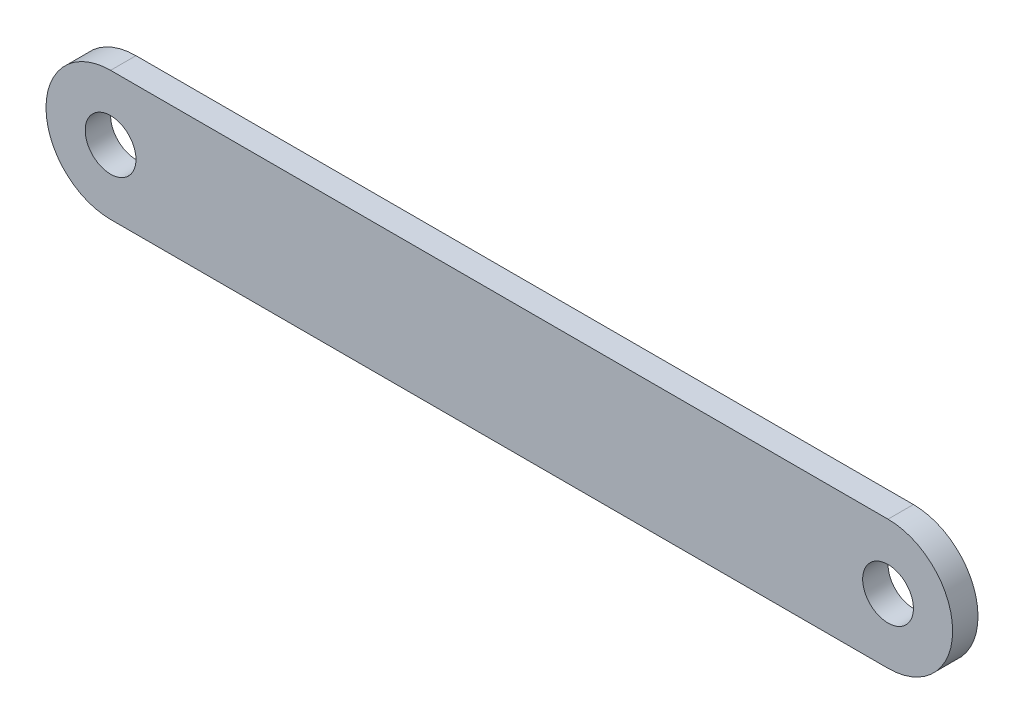
ISO-10303-21;
HEADER;
FILE_DESCRIPTION(('STEP AP214'),'2;1');
FILE_NAME('part.step','',(''),(''),'','','');
FILE_SCHEMA(('AUTOMOTIVE_DESIGN { 1 0 10303 214 1 1 1 1 }'));
ENDSEC;
DATA;
#1=APPLICATION_CONTEXT('core data for automotive mechanical design processes');
#2=APPLICATION_PROTOCOL_DEFINITION('international standard','automotive_design',2000,#1);
#3=PRODUCT_CONTEXT('',#1,'mechanical');
#4=PRODUCT('Part','Part','',(#3));
#5=PRODUCT_RELATED_PRODUCT_CATEGORY('part','',(#4));
#6=PRODUCT_DEFINITION_FORMATION('','',#4);
#7=PRODUCT_DEFINITION_CONTEXT('part definition',#1,'design');
#8=PRODUCT_DEFINITION('design','',#6,#7);
#9=PRODUCT_DEFINITION_SHAPE('','',#8);
#10=(LENGTH_UNIT() NAMED_UNIT(*) SI_UNIT(.MILLI.,.METRE.));
#11=(NAMED_UNIT(*) PLANE_ANGLE_UNIT() SI_UNIT($,.RADIAN.));
#12=(NAMED_UNIT(*) SI_UNIT($,.STERADIAN.) SOLID_ANGLE_UNIT());
#13=UNCERTAINTY_MEASURE_WITH_UNIT(LENGTH_MEASURE(1.E-05),#10,'distance_accuracy_value','');
#14=(GEOMETRIC_REPRESENTATION_CONTEXT(3) GLOBAL_UNCERTAINTY_ASSIGNED_CONTEXT((#13)) GLOBAL_UNIT_ASSIGNED_CONTEXT((#10,
#11,#12)) REPRESENTATION_CONTEXT('',''));
#15=CARTESIAN_POINT('',(0.,0.,0.));
#16=DIRECTION('',(0.,0.,1.));
#17=DIRECTION('',(1.,0.,0.));
#18=AXIS2_PLACEMENT_3D('',#15,#16,#17);
#19=CARTESIAN_POINT('',(15.315,0.,1.));
#20=DIRECTION('',(0.,0.,-1.));
#21=DIRECTION('',(-1.,0.,0.));
#22=AXIS2_PLACEMENT_3D('',#19,#20,#21);
#23=PLANE('',#22);
#24=CARTESIAN_POINT('',(15.315,0.,1.));
#25=DIRECTION('',(0.,0.,1.));
#26=DIRECTION('',(-1.,0.,0.));
#27=AXIS2_PLACEMENT_3D('',#24,#25,#26);
#28=CIRCLE('',#27,2.54477814163833);
#29=CARTESIAN_POINT('',(15.315,-2.54477814163833,1.));
#30=VERTEX_POINT('',#29);
#31=CARTESIAN_POINT('',(15.315,2.54477814163833,1.));
#32=VERTEX_POINT('',#31);
#33=EDGE_CURVE('E96',#30,#32,#28,.T.);
#34=ORIENTED_EDGE('',*,*,#33,.T.);
#35=DIRECTION('',(-1.,0.,0.));
#36=VECTOR('',#35,1.);
#37=CARTESIAN_POINT('',(-15.315,2.54477814163833,1.));
#38=LINE('',#37,#36);
#39=CARTESIAN_POINT('',(-15.315,2.54477814163833,1.));
#40=VERTEX_POINT('',#39);
#41=EDGE_CURVE('E91',#32,#40,#38,.T.);
#42=ORIENTED_EDGE('',*,*,#41,.T.);
#43=CARTESIAN_POINT('',(-15.315,0.,1.));
#44=DIRECTION('',(0.,0.,1.));
#45=DIRECTION('',(1.,0.,0.));
#46=AXIS2_PLACEMENT_3D('',#43,#44,#45);
#47=CIRCLE('',#46,2.54477814163833);
#48=CARTESIAN_POINT('',(-15.315,-2.54477814163833,1.));
#49=VERTEX_POINT('',#48);
#50=EDGE_CURVE('E94',#40,#49,#47,.T.);
#51=ORIENTED_EDGE('',*,*,#50,.T.);
#52=DIRECTION('',(1.,0.,0.));
#53=VECTOR('',#52,1.);
#54=CARTESIAN_POINT('',(-15.315,-2.54477814163833,1.));
#55=LINE('',#54,#53);
#56=EDGE_CURVE('E61',#49,#30,#55,.T.);
#57=ORIENTED_EDGE('',*,*,#56,.T.);
#58=EDGE_LOOP('',(#34,#42,#51,#57));
#59=FACE_BOUND('',#58,.T.);
#60=CARTESIAN_POINT('',(-15.315,0.,1.));
#61=DIRECTION('',(0.,0.,1.));
#62=DIRECTION('',(1.,0.,0.));
#63=AXIS2_PLACEMENT_3D('',#60,#61,#62);
#64=CIRCLE('',#63,1.);
#65=CARTESIAN_POINT('',(-14.315,0.,1.));
#66=VERTEX_POINT('',#65);
#67=EDGE_CURVE('E116',#66,#66,#64,.T.);
#68=ORIENTED_EDGE('',*,*,#67,.F.);
#69=EDGE_LOOP('',(#68));
#70=FACE_BOUND('',#69,.T.);
#71=CARTESIAN_POINT('',(15.315,0.,1.));
#72=DIRECTION('',(0.,0.,1.));
#73=DIRECTION('',(1.,0.,0.));
#74=AXIS2_PLACEMENT_3D('',#71,#72,#73);
#75=CIRCLE('',#74,1.);
#76=CARTESIAN_POINT('',(16.315,0.,1.));
#77=VERTEX_POINT('',#76);
#78=EDGE_CURVE('E138',#77,#77,#75,.T.);
#79=ORIENTED_EDGE('',*,*,#78,.F.);
#80=EDGE_LOOP('',(#79));
#81=FACE_BOUND('',#80,.T.);
#82=ADVANCED_FACE('F43',(#59,#70,#81),#23,.F.);
#83=CARTESIAN_POINT('',(15.315,0.,0.));
#84=DIRECTION('',(0.,0.,-1.));
#85=DIRECTION('',(-1.,0.,0.));
#86=AXIS2_PLACEMENT_3D('',#83,#84,#85);
#87=PLANE('',#86);
#88=CARTESIAN_POINT('',(-15.315,0.,0.));
#89=DIRECTION('',(0.,0.,1.));
#90=DIRECTION('',(1.,0.,0.));
#91=AXIS2_PLACEMENT_3D('',#88,#89,#90);
#92=CIRCLE('',#91,1.);
#93=CARTESIAN_POINT('',(-14.315,0.,0.));
#94=VERTEX_POINT('',#93);
#95=EDGE_CURVE('E134',#94,#94,#92,.T.);
#96=ORIENTED_EDGE('',*,*,#95,.T.);
#97=EDGE_LOOP('',(#96));
#98=FACE_BOUND('',#97,.T.);
#99=CARTESIAN_POINT('',(15.315,0.,0.));
#100=DIRECTION('',(0.,0.,1.));
#101=DIRECTION('',(-1.,0.,0.));
#102=AXIS2_PLACEMENT_3D('',#99,#100,#101);
#103=CIRCLE('',#102,2.54477814163833);
#104=CARTESIAN_POINT('',(15.315,-2.54477814163833,0.));
#105=VERTEX_POINT('',#104);
#106=CARTESIAN_POINT('',(15.315,2.54477814163833,0.));
#107=VERTEX_POINT('',#106);
#108=EDGE_CURVE('E112',#105,#107,#103,.T.);
#109=ORIENTED_EDGE('',*,*,#108,.F.);
#110=DIRECTION('',(1.,0.,0.));
#111=VECTOR('',#110,1.);
#112=CARTESIAN_POINT('',(-15.315,-2.54477814163833,0.));
#113=LINE('',#112,#111);
#114=CARTESIAN_POINT('',(-15.315,-2.54477814163833,0.));
#115=VERTEX_POINT('',#114);
#116=EDGE_CURVE('E84',#115,#105,#113,.T.);
#117=ORIENTED_EDGE('',*,*,#116,.F.);
#118=CARTESIAN_POINT('',(-15.315,0.,0.));
#119=DIRECTION('',(0.,0.,1.));
#120=DIRECTION('',(1.,0.,0.));
#121=AXIS2_PLACEMENT_3D('',#118,#119,#120);
#122=CIRCLE('',#121,2.54477814163833);
#123=CARTESIAN_POINT('',(-15.315,2.54477814163833,0.));
#124=VERTEX_POINT('',#123);
#125=EDGE_CURVE('E78',#124,#115,#122,.T.);
#126=ORIENTED_EDGE('',*,*,#125,.F.);
#127=DIRECTION('',(-1.,0.,0.));
#128=VECTOR('',#127,1.);
#129=CARTESIAN_POINT('',(-15.315,2.54477814163833,0.));
#130=LINE('',#129,#128);
#131=EDGE_CURVE('E101',#107,#124,#130,.T.);
#132=ORIENTED_EDGE('',*,*,#131,.F.);
#133=EDGE_LOOP('',(#109,#117,#126,#132));
#134=FACE_BOUND('',#133,.T.);
#135=CARTESIAN_POINT('',(15.315,0.,0.));
#136=DIRECTION('',(0.,0.,1.));
#137=DIRECTION('',(1.,0.,0.));
#138=AXIS2_PLACEMENT_3D('',#135,#136,#137);
#139=CIRCLE('',#138,1.);
#140=CARTESIAN_POINT('',(16.315,0.,0.));
#141=VERTEX_POINT('',#140);
#142=EDGE_CURVE('E142',#141,#141,#139,.T.);
#143=ORIENTED_EDGE('',*,*,#142,.T.);
#144=EDGE_LOOP('',(#143));
#145=FACE_BOUND('',#144,.T.);
#146=ADVANCED_FACE('F129',(#98,#134,#145),#87,.T.);
#147=CARTESIAN_POINT('',(15.315,0.,1.));
#148=DIRECTION('',(0.,0.,-1.));
#149=DIRECTION('',(-1.,0.,0.));
#150=AXIS2_PLACEMENT_3D('',#147,#148,#149);
#151=CYLINDRICAL_SURFACE('',#150,2.54477814163833);
#152=ORIENTED_EDGE('',*,*,#108,.T.);
#153=DIRECTION('',(0.,0.,-1.));
#154=VECTOR('',#153,1.);
#155=CARTESIAN_POINT('',(15.315,2.54477814163833,1.));
#156=LINE('',#155,#154);
#157=EDGE_CURVE('E11',#32,#107,#156,.T.);
#158=ORIENTED_EDGE('',*,*,#157,.F.);
#159=ORIENTED_EDGE('',*,*,#33,.F.);
#160=DIRECTION('',(0.,0.,-1.));
#161=VECTOR('',#160,1.);
#162=CARTESIAN_POINT('',(15.315,-2.54477814163833,1.));
#163=LINE('',#162,#161);
#164=EDGE_CURVE('E108',#30,#105,#163,.T.);
#165=ORIENTED_EDGE('',*,*,#164,.T.);
#166=EDGE_LOOP('',(#152,#158,#159,#165));
#167=FACE_BOUND('',#166,.T.);
#168=ADVANCED_FACE('F45',(#167),#151,.T.);
#169=CARTESIAN_POINT('',(-15.315,2.54477814163833,1.));
#170=DIRECTION('',(0.,-1.,0.));
#171=DIRECTION('',(0.,0.,-1.));
#172=AXIS2_PLACEMENT_3D('',#169,#170,#171);
#173=PLANE('',#172);
#174=ORIENTED_EDGE('',*,*,#131,.T.);
#175=DIRECTION('',(0.,0.,-1.));
#176=VECTOR('',#175,1.);
#177=CARTESIAN_POINT('',(-15.315,2.54477814163833,1.));
#178=LINE('',#177,#176);
#179=EDGE_CURVE('E53',#40,#124,#178,.T.);
#180=ORIENTED_EDGE('',*,*,#179,.F.);
#181=ORIENTED_EDGE('',*,*,#41,.F.);
#182=ORIENTED_EDGE('',*,*,#157,.T.);
#183=EDGE_LOOP('',(#174,#180,#181,#182));
#184=FACE_BOUND('',#183,.T.);
#185=ADVANCED_FACE('F100',(#184),#173,.F.);
#186=CARTESIAN_POINT('',(-15.315,0.,1.));
#187=DIRECTION('',(0.,0.,-1.));
#188=DIRECTION('',(-1.,0.,0.));
#189=AXIS2_PLACEMENT_3D('',#186,#187,#188);
#190=CYLINDRICAL_SURFACE('',#189,2.54477814163833);
#191=ORIENTED_EDGE('',*,*,#125,.T.);
#192=DIRECTION('',(0.,0.,-1.));
#193=VECTOR('',#192,1.);
#194=CARTESIAN_POINT('',(-15.315,-2.54477814163833,1.));
#195=LINE('',#194,#193);
#196=EDGE_CURVE('E103',#49,#115,#195,.T.);
#197=ORIENTED_EDGE('',*,*,#196,.F.);
#198=ORIENTED_EDGE('',*,*,#50,.F.);
#199=ORIENTED_EDGE('',*,*,#179,.T.);
#200=EDGE_LOOP('',(#191,#197,#198,#199));
#201=FACE_BOUND('',#200,.T.);
#202=ADVANCED_FACE('F104',(#201),#190,.T.);
#203=CARTESIAN_POINT('',(-15.315,-2.54477814163833,1.));
#204=DIRECTION('',(0.,1.,0.));
#205=DIRECTION('',(0.,0.,1.));
#206=AXIS2_PLACEMENT_3D('',#203,#204,#205);
#207=PLANE('',#206);
#208=ORIENTED_EDGE('',*,*,#116,.T.);
#209=ORIENTED_EDGE('',*,*,#164,.F.);
#210=ORIENTED_EDGE('',*,*,#56,.F.);
#211=ORIENTED_EDGE('',*,*,#196,.T.);
#212=EDGE_LOOP('',(#208,#209,#210,#211));
#213=FACE_BOUND('',#212,.T.);
#214=ADVANCED_FACE('F126',(#213),#207,.F.);
#215=CARTESIAN_POINT('',(-15.315,0.,1.));
#216=DIRECTION('',(0.,0.,-1.));
#217=DIRECTION('',(-1.,0.,0.));
#218=AXIS2_PLACEMENT_3D('',#215,#216,#217);
#219=CYLINDRICAL_SURFACE('',#218,1.);
#220=ORIENTED_EDGE('',*,*,#67,.T.);
#221=EDGE_LOOP('',(#220));
#222=FACE_BOUND('',#221,.T.);
#223=ORIENTED_EDGE('',*,*,#95,.F.);
#224=EDGE_LOOP('',(#223));
#225=FACE_BOUND('',#224,.T.);
#226=ADVANCED_FACE('F161',(#222,#225),#219,.F.);
#227=CARTESIAN_POINT('',(15.315,0.,1.));
#228=DIRECTION('',(0.,0.,-1.));
#229=DIRECTION('',(-1.,0.,0.));
#230=AXIS2_PLACEMENT_3D('',#227,#228,#229);
#231=CYLINDRICAL_SURFACE('',#230,1.);
#232=ORIENTED_EDGE('',*,*,#78,.T.);
#233=EDGE_LOOP('',(#232));
#234=FACE_BOUND('',#233,.T.);
#235=ORIENTED_EDGE('',*,*,#142,.F.);
#236=EDGE_LOOP('',(#235));
#237=FACE_BOUND('',#236,.T.);
#238=ADVANCED_FACE('F150',(#234,#237),#231,.F.);
#239=CLOSED_SHELL('',(#82,#146,#168,#185,#202,#214,#226,#238));
#240=MANIFOLD_SOLID_BREP('B2',#239);
#241=ADVANCED_BREP_SHAPE_REPRESENTATION('',(#18,#240),#14);
#242=SHAPE_DEFINITION_REPRESENTATION(#9,#241);
ENDSEC;
END-ISO-10303-21;
